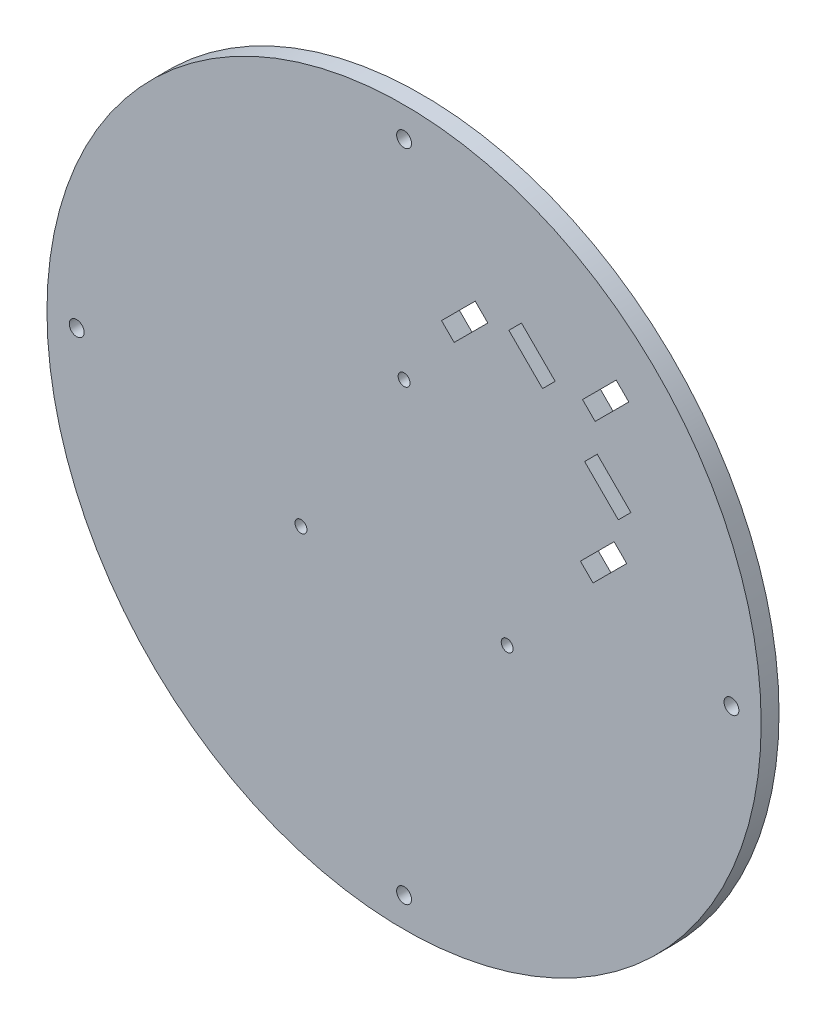
ISO-10303-21;
HEADER;
FILE_DESCRIPTION(('STEP AP214'),'2;1');
FILE_NAME('part.step','',(''),(''),'','','');
FILE_SCHEMA(('AUTOMOTIVE_DESIGN { 1 0 10303 214 1 1 1 1 }'));
ENDSEC;
DATA;
#1=APPLICATION_CONTEXT('core data for automotive mechanical design processes');
#2=APPLICATION_PROTOCOL_DEFINITION('international standard','automotive_design',2000,#1);
#3=PRODUCT_CONTEXT('',#1,'mechanical');
#4=PRODUCT('Part','Part','',(#3));
#5=PRODUCT_RELATED_PRODUCT_CATEGORY('part','',(#4));
#6=PRODUCT_DEFINITION_FORMATION('','',#4);
#7=PRODUCT_DEFINITION_CONTEXT('part definition',#1,'design');
#8=PRODUCT_DEFINITION('design','',#6,#7);
#9=PRODUCT_DEFINITION_SHAPE('','',#8);
#10=(LENGTH_UNIT() NAMED_UNIT(*) SI_UNIT(.MILLI.,.METRE.));
#11=(NAMED_UNIT(*) PLANE_ANGLE_UNIT() SI_UNIT($,.RADIAN.));
#12=(NAMED_UNIT(*) SI_UNIT($,.STERADIAN.) SOLID_ANGLE_UNIT());
#13=UNCERTAINTY_MEASURE_WITH_UNIT(LENGTH_MEASURE(1.E-05),#10,'distance_accuracy_value','');
#14=(GEOMETRIC_REPRESENTATION_CONTEXT(3) GLOBAL_UNCERTAINTY_ASSIGNED_CONTEXT((#13)) GLOBAL_UNIT_ASSIGNED_CONTEXT((#10,
#11,#12)) REPRESENTATION_CONTEXT('',''));
#15=CARTESIAN_POINT('',(0.,0.,0.));
#16=DIRECTION('',(0.,0.,1.));
#17=DIRECTION('',(1.,0.,0.));
#18=AXIS2_PLACEMENT_3D('',#15,#16,#17);
#19=CARTESIAN_POINT('',(24.6780266634107,24.6780266634104,3.));
#20=DIRECTION('',(-0.707106781186551,-0.707106781186544,0.));
#21=DIRECTION('',(0.707106781186544,-0.707106781186551,0.));
#22=AXIS2_PLACEMENT_3D('',#19,#20,#21);
#23=PLANE('',#22);
#24=DIRECTION('',(-0.707106781186544,0.707106781186551,0.));
#25=VECTOR('',#24,1.);
#26=CARTESIAN_POINT('',(24.6780266634107,24.6780266634104,0.));
#27=LINE('',#26,#25);
#28=CARTESIAN_POINT('',(37.4059487247684,11.9501046020526,0.));
#29=VERTEX_POINT('',#28);
#30=CARTESIAN_POINT('',(35.2846283812088,14.0714249456122,0.));
#31=VERTEX_POINT('',#30);
#32=EDGE_CURVE('E273',#29,#31,#27,.T.);
#33=ORIENTED_EDGE('',*,*,#32,.F.);
#34=DIRECTION('',(0.,0.,-1.));
#35=VECTOR('',#34,1.);
#36=CARTESIAN_POINT('',(37.4059487247684,11.9501046020526,3.));
#37=LINE('',#36,#35);
#38=CARTESIAN_POINT('',(37.4059487247684,11.9501046020526,3.));
#39=VERTEX_POINT('',#38);
#40=EDGE_CURVE('E11',#39,#29,#37,.T.);
#41=ORIENTED_EDGE('',*,*,#40,.F.);
#42=DIRECTION('',(-0.707106781186544,0.707106781186551,0.));
#43=VECTOR('',#42,1.);
#44=CARTESIAN_POINT('',(24.6780266634107,24.6780266634104,3.));
#45=LINE('',#44,#43);
#46=CARTESIAN_POINT('',(35.2846283812088,14.0714249456122,3.));
#47=VERTEX_POINT('',#46);
#48=EDGE_CURVE('E199',#39,#47,#45,.T.);
#49=ORIENTED_EDGE('',*,*,#48,.T.);
#50=DIRECTION('',(0.,0.,-1.));
#51=VECTOR('',#50,1.);
#52=CARTESIAN_POINT('',(35.2846283812088,14.0714249456122,3.));
#53=LINE('',#52,#51);
#54=EDGE_CURVE('E57',#47,#31,#53,.T.);
#55=ORIENTED_EDGE('',*,*,#54,.T.);
#56=EDGE_LOOP('',(#33,#41,#49,#55));
#57=FACE_BOUND('',#56,.T.);
#58=ADVANCED_FACE('F38',(#57),#23,.T.);
#59=CARTESIAN_POINT('',(12.7279220613579,-12.7279220613579,3.));
#60=DIRECTION('',(-0.707106781186547,0.707106781186548,0.));
#61=DIRECTION('',(-0.707106781186548,-0.707106781186547,0.));
#62=AXIS2_PLACEMENT_3D('',#59,#60,#61);
#63=PLANE('',#62);
#64=DIRECTION('',(0.707106781186548,0.707106781186547,0.));
#65=VECTOR('',#64,1.);
#66=CARTESIAN_POINT('',(12.7279220613579,-12.7279220613579,0.));
#67=LINE('',#66,#65);
#68=CARTESIAN_POINT('',(31.749094475276,6.2932503525602,0.));
#69=VERTEX_POINT('',#68);
#70=EDGE_CURVE('E187',#69,#29,#67,.T.);
#71=ORIENTED_EDGE('',*,*,#70,.F.);
#72=DIRECTION('',(0.,0.,-1.));
#73=VECTOR('',#72,1.);
#74=CARTESIAN_POINT('',(31.749094475276,6.2932503525602,3.));
#75=LINE('',#74,#73);
#76=CARTESIAN_POINT('',(31.749094475276,6.2932503525602,3.));
#77=VERTEX_POINT('',#76);
#78=EDGE_CURVE('E48',#77,#69,#75,.T.);
#79=ORIENTED_EDGE('',*,*,#78,.F.);
#80=DIRECTION('',(0.707106781186548,0.707106781186547,0.));
#81=VECTOR('',#80,1.);
#82=CARTESIAN_POINT('',(12.7279220613579,-12.7279220613579,3.));
#83=LINE('',#82,#81);
#84=EDGE_CURVE('E185',#77,#39,#83,.T.);
#85=ORIENTED_EDGE('',*,*,#84,.T.);
#86=ORIENTED_EDGE('',*,*,#40,.T.);
#87=EDGE_LOOP('',(#71,#79,#85,#86));
#88=FACE_BOUND('',#87,.T.);
#89=ADVANCED_FACE('F184',(#88),#63,.T.);
#90=CARTESIAN_POINT('',(19.0211724139182,19.0211724139181,3.));
#91=DIRECTION('',(0.70710678118655,0.707106781186545,0.));
#92=DIRECTION('',(-0.707106781186545,0.70710678118655,0.));
#93=AXIS2_PLACEMENT_3D('',#90,#91,#92);
#94=PLANE('',#93);
#95=DIRECTION('',(0.707106781186545,-0.70710678118655,0.));
#96=VECTOR('',#95,1.);
#97=CARTESIAN_POINT('',(19.0211724139182,19.0211724139181,0.));
#98=LINE('',#97,#96);
#99=CARTESIAN_POINT('',(29.6277741317164,8.41457069611985,0.));
#100=VERTEX_POINT('',#99);
#101=EDGE_CURVE('E276',#100,#69,#98,.T.);
#102=ORIENTED_EDGE('',*,*,#101,.F.);
#103=DIRECTION('',(0.,0.,-1.));
#104=VECTOR('',#103,1.);
#105=CARTESIAN_POINT('',(29.6277741317164,8.41457069611985,3.));
#106=LINE('',#105,#104);
#107=CARTESIAN_POINT('',(29.6277741317164,8.41457069611985,3.));
#108=VERTEX_POINT('',#107);
#109=EDGE_CURVE('E118',#108,#100,#106,.T.);
#110=ORIENTED_EDGE('',*,*,#109,.F.);
#111=DIRECTION('',(0.707106781186545,-0.70710678118655,0.));
#112=VECTOR('',#111,1.);
#113=CARTESIAN_POINT('',(19.0211724139182,19.0211724139181,3.));
#114=LINE('',#113,#112);
#115=EDGE_CURVE('E198',#108,#77,#114,.T.);
#116=ORIENTED_EDGE('',*,*,#115,.T.);
#117=ORIENTED_EDGE('',*,*,#78,.T.);
#118=EDGE_LOOP('',(#102,#110,#116,#117));
#119=FACE_BOUND('',#118,.T.);
#120=ADVANCED_FACE('F201',(#119),#94,.T.);
#121=CARTESIAN_POINT('',(19.0211724139184,19.0211724139183,3.));
#122=DIRECTION('',(-0.707106781186548,-0.707106781186546,0.));
#123=DIRECTION('',(0.707106781186547,-0.707106781186549,0.));
#124=AXIS2_PLACEMENT_3D('',#121,#122,#123);
#125=PLANE('',#124);
#126=DIRECTION('',(-0.707106781186547,0.707106781186549,0.));
#127=VECTOR('',#126,1.);
#128=CARTESIAN_POINT('',(19.0211724139184,19.0211724139183,0.));
#129=LINE('',#128,#127);
#130=CARTESIAN_POINT('',(8.41457069611997,29.6277741317168,0.));
#131=VERTEX_POINT('',#130);
#132=CARTESIAN_POINT('',(6.29325035256034,31.7490944752764,0.));
#133=VERTEX_POINT('',#132);
#134=EDGE_CURVE('E264',#131,#133,#129,.T.);
#135=ORIENTED_EDGE('',*,*,#134,.T.);
#136=DIRECTION('',(0.,0.,-1.));
#137=VECTOR('',#136,1.);
#138=CARTESIAN_POINT('',(6.29325035256034,31.7490944752764,3.));
#139=LINE('',#138,#137);
#140=CARTESIAN_POINT('',(6.29325035256034,31.7490944752764,3.));
#141=VERTEX_POINT('',#140);
#142=EDGE_CURVE('E289',#141,#133,#139,.T.);
#143=ORIENTED_EDGE('',*,*,#142,.F.);
#144=DIRECTION('',(-0.707106781186547,0.707106781186549,0.));
#145=VECTOR('',#144,1.);
#146=CARTESIAN_POINT('',(19.0211724139184,19.0211724139183,3.));
#147=LINE('',#146,#145);
#148=CARTESIAN_POINT('',(8.41457069611997,29.6277741317168,3.));
#149=VERTEX_POINT('',#148);
#150=EDGE_CURVE('E391',#149,#141,#147,.T.);
#151=ORIENTED_EDGE('',*,*,#150,.F.);
#152=DIRECTION('',(0.,0.,-1.));
#153=VECTOR('',#152,1.);
#154=CARTESIAN_POINT('',(8.41457069611997,29.6277741317168,3.));
#155=LINE('',#154,#153);
#156=EDGE_CURVE('E291',#149,#131,#155,.T.);
#157=ORIENTED_EDGE('',*,*,#156,.T.);
#158=EDGE_LOOP('',(#135,#143,#151,#157));
#159=FACE_BOUND('',#158,.T.);
#160=ADVANCED_FACE('F429',(#159),#125,.F.);
#161=CARTESIAN_POINT('',(-12.727922061358,12.727922061358,3.));
#162=DIRECTION('',(-0.707106781186547,0.707106781186547,0.));
#163=DIRECTION('',(-0.707106781186548,-0.707106781186548,0.));
#164=AXIS2_PLACEMENT_3D('',#161,#162,#163);
#165=PLANE('',#164);
#166=DIRECTION('',(0.707106781186548,0.707106781186548,0.));
#167=VECTOR('',#166,1.);
#168=CARTESIAN_POINT('',(-12.727922061358,12.727922061358,0.));
#169=LINE('',#168,#167);
#170=CARTESIAN_POINT('',(11.9501046020527,37.4059487247688,0.));
#171=VERTEX_POINT('',#170);
#172=EDGE_CURVE('E267',#133,#171,#169,.T.);
#173=ORIENTED_EDGE('',*,*,#172,.T.);
#174=DIRECTION('',(0.,0.,-1.));
#175=VECTOR('',#174,1.);
#176=CARTESIAN_POINT('',(11.9501046020527,37.4059487247688,3.));
#177=LINE('',#176,#175);
#178=CARTESIAN_POINT('',(11.9501046020527,37.4059487247688,3.));
#179=VERTEX_POINT('',#178);
#180=EDGE_CURVE('E298',#179,#171,#177,.T.);
#181=ORIENTED_EDGE('',*,*,#180,.F.);
#182=DIRECTION('',(0.707106781186548,0.707106781186548,0.));
#183=VECTOR('',#182,1.);
#184=CARTESIAN_POINT('',(-12.727922061358,12.727922061358,3.));
#185=LINE('',#184,#183);
#186=EDGE_CURVE('E394',#141,#179,#185,.T.);
#187=ORIENTED_EDGE('',*,*,#186,.F.);
#188=ORIENTED_EDGE('',*,*,#142,.T.);
#189=EDGE_LOOP('',(#173,#181,#187,#188));
#190=FACE_BOUND('',#189,.T.);
#191=ADVANCED_FACE('F425',(#190),#165,.F.);
#192=CARTESIAN_POINT('',(24.6780266634108,24.6780266634107,3.));
#193=DIRECTION('',(0.707106781186549,0.707106781186546,0.));
#194=DIRECTION('',(-0.707106781186546,0.707106781186549,0.));
#195=AXIS2_PLACEMENT_3D('',#192,#193,#194);
#196=PLANE('',#195);
#197=DIRECTION('',(0.707106781186546,-0.707106781186549,0.));
#198=VECTOR('',#197,1.);
#199=CARTESIAN_POINT('',(24.6780266634108,24.6780266634107,0.));
#200=LINE('',#199,#198);
#201=CARTESIAN_POINT('',(14.0714249456124,35.2846283812092,0.));
#202=VERTEX_POINT('',#201);
#203=EDGE_CURVE('E269',#171,#202,#200,.T.);
#204=ORIENTED_EDGE('',*,*,#203,.T.);
#205=DIRECTION('',(0.,0.,-1.));
#206=VECTOR('',#205,1.);
#207=CARTESIAN_POINT('',(14.0714249456124,35.2846283812092,3.));
#208=LINE('',#207,#206);
#209=CARTESIAN_POINT('',(14.0714249456124,35.2846283812092,3.));
#210=VERTEX_POINT('',#209);
#211=EDGE_CURVE('E294',#210,#202,#208,.T.);
#212=ORIENTED_EDGE('',*,*,#211,.F.);
#213=DIRECTION('',(0.707106781186546,-0.707106781186549,0.));
#214=VECTOR('',#213,1.);
#215=CARTESIAN_POINT('',(24.6780266634108,24.6780266634107,3.));
#216=LINE('',#215,#214);
#217=EDGE_CURVE('E396',#179,#210,#216,.T.);
#218=ORIENTED_EDGE('',*,*,#217,.F.);
#219=ORIENTED_EDGE('',*,*,#180,.T.);
#220=EDGE_LOOP('',(#204,#212,#218,#219));
#221=FACE_BOUND('',#220,.T.);
#222=ADVANCED_FACE('F421',(#221),#196,.F.);
#223=CARTESIAN_POINT('',(36.698841943582,36.698841943582,3.));
#224=DIRECTION('',(0.707106781186547,0.707106781186547,0.));
#225=DIRECTION('',(-0.707106781186548,0.707106781186548,0.));
#226=AXIS2_PLACEMENT_3D('',#223,#224,#225);
#227=PLANE('',#226);
#228=DIRECTION('',(0.707106781186548,-0.707106781186548,0.));
#229=VECTOR('',#228,1.);
#230=CARTESIAN_POINT('',(36.698841943582,36.698841943582,0.));
#231=LINE('',#230,#229);
#232=CARTESIAN_POINT('',(35.6381817718023,37.7595021153618,0.));
#233=VERTEX_POINT('',#232);
#234=CARTESIAN_POINT('',(37.7595021153619,35.6381817718021,0.));
#235=VERTEX_POINT('',#234);
#236=EDGE_CURVE('E253',#233,#235,#231,.T.);
#237=ORIENTED_EDGE('',*,*,#236,.T.);
#238=DIRECTION('',(0.,0.,-1.));
#239=VECTOR('',#238,1.);
#240=CARTESIAN_POINT('',(37.7595021153619,35.6381817718021,3.));
#241=LINE('',#240,#239);
#242=CARTESIAN_POINT('',(37.7595021153619,35.6381817718021,3.));
#243=VERTEX_POINT('',#242);
#244=EDGE_CURVE('E295',#243,#235,#241,.T.);
#245=ORIENTED_EDGE('',*,*,#244,.F.);
#246=DIRECTION('',(0.707106781186548,-0.707106781186548,0.));
#247=VECTOR('',#246,1.);
#248=CARTESIAN_POINT('',(36.698841943582,36.698841943582,3.));
#249=LINE('',#248,#247);
#250=CARTESIAN_POINT('',(35.6381817718023,37.7595021153618,3.));
#251=VERTEX_POINT('',#250);
#252=EDGE_CURVE('E381',#251,#243,#249,.T.);
#253=ORIENTED_EDGE('',*,*,#252,.F.);
#254=DIRECTION('',(0.,0.,-1.));
#255=VECTOR('',#254,1.);
#256=CARTESIAN_POINT('',(35.6381817718023,37.7595021153618,3.));
#257=LINE('',#256,#255);
#258=EDGE_CURVE('E303',#251,#233,#257,.T.);
#259=ORIENTED_EDGE('',*,*,#258,.T.);
#260=EDGE_LOOP('',(#237,#245,#253,#259));
#261=FACE_BOUND('',#260,.T.);
#262=ADVANCED_FACE('F424',(#261),#227,.F.);
#263=CARTESIAN_POINT('',(1.06066017177984,-1.06066017177985,3.));
#264=DIRECTION('',(0.707106781186546,-0.707106781186549,0.));
#265=DIRECTION('',(0.707106781186549,0.707106781186546,0.));
#266=AXIS2_PLACEMENT_3D('',#263,#264,#265);
#267=PLANE('',#266);
#268=DIRECTION('',(-0.707106781186549,-0.707106781186546,0.));
#269=VECTOR('',#268,1.);
#270=CARTESIAN_POINT('',(1.06066017177984,-1.06066017177985,0.));
#271=LINE('',#270,#269);
#272=CARTESIAN_POINT('',(32.1026478658696,29.9813275223098,0.));
#273=VERTEX_POINT('',#272);
#274=EDGE_CURVE('E256',#235,#273,#271,.T.);
#275=ORIENTED_EDGE('',*,*,#274,.T.);
#276=DIRECTION('',(0.,0.,-1.));
#277=VECTOR('',#276,1.);
#278=CARTESIAN_POINT('',(32.1026478658696,29.9813275223098,3.));
#279=LINE('',#278,#277);
#280=CARTESIAN_POINT('',(32.1026478658696,29.9813275223098,3.));
#281=VERTEX_POINT('',#280);
#282=EDGE_CURVE('E309',#281,#273,#279,.T.);
#283=ORIENTED_EDGE('',*,*,#282,.F.);
#284=DIRECTION('',(-0.707106781186549,-0.707106781186546,0.));
#285=VECTOR('',#284,1.);
#286=CARTESIAN_POINT('',(1.06066017177984,-1.06066017177985,3.));
#287=LINE('',#286,#285);
#288=EDGE_CURVE('E384',#243,#281,#287,.T.);
#289=ORIENTED_EDGE('',*,*,#288,.F.);
#290=ORIENTED_EDGE('',*,*,#244,.T.);
#291=EDGE_LOOP('',(#275,#283,#289,#290));
#292=FACE_BOUND('',#291,.T.);
#293=ADVANCED_FACE('F442',(#292),#267,.F.);
#294=CARTESIAN_POINT('',(31.0419876940898,31.0419876940896,3.));
#295=DIRECTION('',(0.70710678118655,0.707106781186545,0.));
#296=DIRECTION('',(-0.707106781186545,0.70710678118655,0.));
#297=AXIS2_PLACEMENT_3D('',#294,#295,#296);
#298=PLANE('',#297);
#299=DIRECTION('',(0.707106781186545,-0.70710678118655,0.));
#300=VECTOR('',#299,1.);
#301=CARTESIAN_POINT('',(31.0419876940898,31.0419876940896,0.));
#302=LINE('',#301,#300);
#303=CARTESIAN_POINT('',(29.9813275223099,32.1026478658694,0.));
#304=VERTEX_POINT('',#303);
#305=EDGE_CURVE('E259',#304,#273,#302,.T.);
#306=ORIENTED_EDGE('',*,*,#305,.F.);
#307=DIRECTION('',(0.,0.,-1.));
#308=VECTOR('',#307,1.);
#309=CARTESIAN_POINT('',(29.9813275223099,32.1026478658694,3.));
#310=LINE('',#309,#308);
#311=CARTESIAN_POINT('',(29.9813275223099,32.1026478658694,3.));
#312=VERTEX_POINT('',#311);
#313=EDGE_CURVE('E306',#312,#304,#310,.T.);
#314=ORIENTED_EDGE('',*,*,#313,.F.);
#315=DIRECTION('',(0.707106781186545,-0.70710678118655,0.));
#316=VECTOR('',#315,1.);
#317=CARTESIAN_POINT('',(31.0419876940898,31.0419876940896,3.));
#318=LINE('',#317,#316);
#319=EDGE_CURVE('E386',#312,#281,#318,.T.);
#320=ORIENTED_EDGE('',*,*,#319,.T.);
#321=ORIENTED_EDGE('',*,*,#282,.T.);
#322=EDGE_LOOP('',(#306,#314,#320,#321));
#323=FACE_BOUND('',#322,.T.);
#324=ADVANCED_FACE('F438',(#323),#298,.T.);
#325=CARTESIAN_POINT('',(28.9206673505308,28.9206673505285,3.));
#326=DIRECTION('',(-0.707106781186575,-0.70710678118652,0.));
#327=DIRECTION('',(0.70710678118652,-0.707106781186575,0.));
#328=AXIS2_PLACEMENT_3D('',#325,#326,#327);
#329=PLANE('',#328);
#330=DIRECTION('',(-0.70710678118652,0.707106781186576,0.));
#331=VECTOR('',#330,1.);
#332=CARTESIAN_POINT('',(28.9206673505308,28.9206673505285,0.));
#333=LINE('',#332,#331);
#334=CARTESIAN_POINT('',(25.3851334445971,32.4562012564625,0.));
#335=VERTEX_POINT('',#334);
#336=CARTESIAN_POINT('',(19.728279195105,38.113055505955,0.));
#337=VERTEX_POINT('',#336);
#338=EDGE_CURVE('E223',#335,#337,#333,.T.);
#339=ORIENTED_EDGE('',*,*,#338,.F.);
#340=DIRECTION('',(0.,0.,-1.));
#341=VECTOR('',#340,1.);
#342=CARTESIAN_POINT('',(25.3851334445971,32.4562012564625,3.));
#343=LINE('',#342,#341);
#344=CARTESIAN_POINT('',(25.3851334445971,32.4562012564625,3.));
#345=VERTEX_POINT('',#344);
#346=EDGE_CURVE('E307',#345,#335,#343,.T.);
#347=ORIENTED_EDGE('',*,*,#346,.F.);
#348=DIRECTION('',(-0.70710678118652,0.707106781186576,0.));
#349=VECTOR('',#348,1.);
#350=CARTESIAN_POINT('',(28.9206673505308,28.9206673505285,3.));
#351=LINE('',#350,#349);
#352=CARTESIAN_POINT('',(19.728279195105,38.113055505955,3.));
#353=VERTEX_POINT('',#352);
#354=EDGE_CURVE('E346',#345,#353,#351,.T.);
#355=ORIENTED_EDGE('',*,*,#354,.T.);
#356=DIRECTION('',(0.,0.,-1.));
#357=VECTOR('',#356,1.);
#358=CARTESIAN_POINT('',(19.728279195105,38.113055505955,3.));
#359=LINE('',#358,#357);
#360=EDGE_CURVE('E313',#353,#337,#359,.T.);
#361=ORIENTED_EDGE('',*,*,#360,.T.);
#362=EDGE_LOOP('',(#339,#347,#355,#361));
#363=FACE_BOUND('',#362,.T.);
#364=ADVANCED_FACE('F441',(#363),#329,.T.);
#365=CARTESIAN_POINT('',(-3.53553390593215,3.535533905932,3.));
#366=DIRECTION('',(-0.707106781186563,0.707106781186532,0.));
#367=DIRECTION('',(-0.707106781186532,-0.707106781186563,0.));
#368=AXIS2_PLACEMENT_3D('',#365,#366,#367);
#369=PLANE('',#368);
#370=DIRECTION('',(0.707106781186532,0.707106781186563,0.));
#371=VECTOR('',#370,1.);
#372=CARTESIAN_POINT('',(-3.53553390593215,3.535533905932,0.));
#373=LINE('',#372,#371);
#374=CARTESIAN_POINT('',(23.2638131010377,30.334880912903,0.));
#375=VERTEX_POINT('',#374);
#376=EDGE_CURVE('E226',#375,#335,#373,.T.);
#377=ORIENTED_EDGE('',*,*,#376,.F.);
#378=DIRECTION('',(0.,0.,-1.));
#379=VECTOR('',#378,1.);
#380=CARTESIAN_POINT('',(23.2638131010377,30.334880912903,3.));
#381=LINE('',#380,#379);
#382=CARTESIAN_POINT('',(23.2638131010377,30.334880912903,3.));
#383=VERTEX_POINT('',#382);
#384=EDGE_CURVE('E317',#383,#375,#381,.T.);
#385=ORIENTED_EDGE('',*,*,#384,.F.);
#386=DIRECTION('',(0.707106781186532,0.707106781186563,0.));
#387=VECTOR('',#386,1.);
#388=CARTESIAN_POINT('',(-3.53553390593215,3.535533905932,3.));
#389=LINE('',#388,#387);
#390=EDGE_CURVE('E350',#383,#345,#389,.T.);
#391=ORIENTED_EDGE('',*,*,#390,.T.);
#392=ORIENTED_EDGE('',*,*,#346,.T.);
#393=EDGE_LOOP('',(#377,#385,#391,#392));
#394=FACE_BOUND('',#393,.T.);
#395=ADVANCED_FACE('F480',(#394),#369,.T.);
#396=CARTESIAN_POINT('',(26.7993470069695,26.7993470069716,3.));
#397=DIRECTION('',(0.70710678118652,0.707106781186575,0.));
#398=DIRECTION('',(-0.707106781186575,0.70710678118652,0.));
#399=AXIS2_PLACEMENT_3D('',#396,#397,#398);
#400=PLANE('',#399);
#401=DIRECTION('',(0.707106781186576,-0.70710678118652,0.));
#402=VECTOR('',#401,1.);
#403=CARTESIAN_POINT('',(26.7993470069695,26.7993470069716,0.));
#404=LINE('',#403,#402);
#405=CARTESIAN_POINT('',(17.6069588515451,35.9917351623952,0.));
#406=VERTEX_POINT('',#405);
#407=EDGE_CURVE('E229',#406,#375,#404,.T.);
#408=ORIENTED_EDGE('',*,*,#407,.F.);
#409=DIRECTION('',(0.,0.,-1.));
#410=VECTOR('',#409,1.);
#411=CARTESIAN_POINT('',(17.6069588515451,35.9917351623952,3.));
#412=LINE('',#411,#410);
#413=CARTESIAN_POINT('',(17.6069588515451,35.9917351623952,3.));
#414=VERTEX_POINT('',#413);
#415=EDGE_CURVE('E315',#414,#406,#412,.T.);
#416=ORIENTED_EDGE('',*,*,#415,.F.);
#417=DIRECTION('',(0.707106781186576,-0.70710678118652,0.));
#418=VECTOR('',#417,1.);
#419=CARTESIAN_POINT('',(26.7993470069695,26.7993470069716,3.));
#420=LINE('',#419,#418);
#421=EDGE_CURVE('E357',#414,#383,#420,.T.);
#422=ORIENTED_EDGE('',*,*,#421,.T.);
#423=ORIENTED_EDGE('',*,*,#384,.T.);
#424=EDGE_LOOP('',(#408,#416,#422,#423));
#425=FACE_BOUND('',#424,.T.);
#426=ADVANCED_FACE('F477',(#425),#400,.T.);
#427=CARTESIAN_POINT('',(3.53553390593273,-3.53553390593274,3.));
#428=DIRECTION('',(-0.707106781186546,0.707106781186548,0.));
#429=DIRECTION('',(-0.707106781186549,-0.707106781186546,0.));
#430=AXIS2_PLACEMENT_3D('',#427,#428,#429);
#431=PLANE('',#430);
#432=DIRECTION('',(0.707106781186549,0.707106781186546,0.));
#433=VECTOR('',#432,1.);
#434=CARTESIAN_POINT('',(3.53553390593273,-3.53553390593274,0.));
#435=LINE('',#434,#433);
#436=CARTESIAN_POINT('',(30.3348809129029,23.2638131010373,0.));
#437=VERTEX_POINT('',#436);
#438=CARTESIAN_POINT('',(32.4562012564625,25.385133444597,0.));
#439=VERTEX_POINT('',#438);
#440=EDGE_CURVE('E214',#437,#439,#435,.T.);
#441=ORIENTED_EDGE('',*,*,#440,.T.);
#442=DIRECTION('',(0.,0.,-1.));
#443=VECTOR('',#442,1.);
#444=CARTESIAN_POINT('',(32.4562012564625,25.385133444597,3.));
#445=LINE('',#444,#443);
#446=CARTESIAN_POINT('',(32.4562012564625,25.385133444597,3.));
#447=VERTEX_POINT('',#446);
#448=EDGE_CURVE('E42',#447,#439,#445,.T.);
#449=ORIENTED_EDGE('',*,*,#448,.F.);
#450=DIRECTION('',(0.707106781186549,0.707106781186546,0.));
#451=VECTOR('',#450,1.);
#452=CARTESIAN_POINT('',(3.53553390593273,-3.53553390593274,3.));
#453=LINE('',#452,#451);
#454=CARTESIAN_POINT('',(30.3348809129029,23.2638131010373,3.));
#455=VERTEX_POINT('',#454);
#456=EDGE_CURVE('E287',#455,#447,#453,.T.);
#457=ORIENTED_EDGE('',*,*,#456,.F.);
#458=DIRECTION('',(0.,0.,-1.));
#459=VECTOR('',#458,1.);
#460=CARTESIAN_POINT('',(30.3348809129029,23.2638131010373,3.));
#461=LINE('',#460,#459);
#462=EDGE_CURVE('E213',#455,#437,#461,.T.);
#463=ORIENTED_EDGE('',*,*,#462,.T.);
#464=EDGE_LOOP('',(#441,#449,#457,#463));
#465=FACE_BOUND('',#464,.T.);
#466=ADVANCED_FACE('F40',(#465),#431,.F.);
#467=CARTESIAN_POINT('',(28.9206673505298,28.9206673505298,3.));
#468=DIRECTION('',(0.707106781186547,0.707106781186547,0.));
#469=DIRECTION('',(-0.707106781186548,0.707106781186548,0.));
#470=AXIS2_PLACEMENT_3D('',#467,#468,#469);
#471=PLANE('',#470);
#472=DIRECTION('',(0.707106781186548,-0.707106781186548,0.));
#473=VECTOR('',#472,1.);
#474=CARTESIAN_POINT('',(28.9206673505298,28.9206673505298,0.));
#475=LINE('',#474,#473);
#476=CARTESIAN_POINT('',(38.1130555059549,19.7282791951046,0.));
#477=VERTEX_POINT('',#476);
#478=EDGE_CURVE('E217',#439,#477,#475,.T.);
#479=ORIENTED_EDGE('',*,*,#478,.T.);
#480=DIRECTION('',(0.,0.,-1.));
#481=VECTOR('',#480,1.);
#482=CARTESIAN_POINT('',(38.1130555059549,19.7282791951046,3.));
#483=LINE('',#482,#481);
#484=CARTESIAN_POINT('',(38.1130555059549,19.7282791951046,3.));
#485=VERTEX_POINT('',#484);
#486=EDGE_CURVE('E324',#485,#477,#483,.T.);
#487=ORIENTED_EDGE('',*,*,#486,.F.);
#488=DIRECTION('',(0.707106781186548,-0.707106781186548,0.));
#489=VECTOR('',#488,1.);
#490=CARTESIAN_POINT('',(28.9206673505298,28.9206673505298,3.));
#491=LINE('',#490,#489);
#492=EDGE_CURVE('E131',#447,#485,#491,.T.);
#493=ORIENTED_EDGE('',*,*,#492,.F.);
#494=ORIENTED_EDGE('',*,*,#448,.T.);
#495=EDGE_LOOP('',(#479,#487,#493,#494));
#496=FACE_BOUND('',#495,.T.);
#497=ADVANCED_FACE('F330',(#496),#471,.F.);
#498=CARTESIAN_POINT('',(9.19238815542534,-9.19238815542526,3.));
#499=DIRECTION('',(0.707106781186551,-0.707106781186544,0.));
#500=DIRECTION('',(0.707106781186544,0.707106781186551,0.));
#501=AXIS2_PLACEMENT_3D('',#498,#499,#500);
#502=PLANE('',#501);
#503=DIRECTION('',(-0.707106781186544,-0.707106781186551,0.));
#504=VECTOR('',#503,1.);
#505=CARTESIAN_POINT('',(9.19238815542534,-9.19238815542526,0.));
#506=LINE('',#505,#504);
#507=CARTESIAN_POINT('',(35.9917351623953,17.606958851545,0.));
#508=VERTEX_POINT('',#507);
#509=EDGE_CURVE('E219',#477,#508,#506,.T.);
#510=ORIENTED_EDGE('',*,*,#509,.T.);
#511=DIRECTION('',(0.,0.,-1.));
#512=VECTOR('',#511,1.);
#513=CARTESIAN_POINT('',(35.9917351623953,17.606958851545,3.));
#514=LINE('',#513,#512);
#515=CARTESIAN_POINT('',(35.9917351623953,17.606958851545,3.));
#516=VERTEX_POINT('',#515);
#517=EDGE_CURVE('E322',#516,#508,#514,.T.);
#518=ORIENTED_EDGE('',*,*,#517,.F.);
#519=DIRECTION('',(-0.707106781186544,-0.707106781186551,0.));
#520=VECTOR('',#519,1.);
#521=CARTESIAN_POINT('',(9.19238815542534,-9.19238815542526,3.));
#522=LINE('',#521,#520);
#523=EDGE_CURVE('E347',#485,#516,#522,.T.);
#524=ORIENTED_EDGE('',*,*,#523,.F.);
#525=ORIENTED_EDGE('',*,*,#486,.T.);
#526=EDGE_LOOP('',(#510,#518,#524,#525));
#527=FACE_BOUND('',#526,.T.);
#528=ADVANCED_FACE('F340',(#527),#502,.F.);
#529=CARTESIAN_POINT('',(0.,0.,3.));
#530=DIRECTION('',(0.,0.,-1.));
#531=DIRECTION('',(-1.,0.,0.));
#532=AXIS2_PLACEMENT_3D('',#529,#530,#531);
#533=CYLINDRICAL_SURFACE('',#532,60.);
#534=CARTESIAN_POINT('',(0.,0.,3.));
#535=DIRECTION('',(0.,0.,1.));
#536=DIRECTION('',(1.,0.,0.));
#537=AXIS2_PLACEMENT_3D('',#534,#535,#536);
#538=CIRCLE('',#537,60.);
#539=CARTESIAN_POINT('',(60.,0.,3.));
#540=VERTEX_POINT('',#539);
#541=EDGE_CURVE('E204',#540,#540,#538,.T.);
#542=ORIENTED_EDGE('',*,*,#541,.F.);
#543=EDGE_LOOP('',(#542));
#544=FACE_BOUND('',#543,.T.);
#545=CARTESIAN_POINT('',(0.,0.,0.));
#546=DIRECTION('',(0.,0.,1.));
#547=DIRECTION('',(1.,0.,0.));
#548=AXIS2_PLACEMENT_3D('',#545,#546,#547);
#549=CIRCLE('',#548,60.);
#550=CARTESIAN_POINT('',(60.,0.,0.));
#551=VERTEX_POINT('',#550);
#552=EDGE_CURVE('E281',#551,#551,#549,.T.);
#553=ORIENTED_EDGE('',*,*,#552,.T.);
#554=EDGE_LOOP('',(#553));
#555=FACE_BOUND('',#554,.T.);
#556=ADVANCED_FACE('F402',(#544,#555),#533,.T.);
#557=CARTESIAN_POINT('',(10.6066017177982,-10.6066017177982,3.));
#558=DIRECTION('',(0.707106781186545,-0.70710678118655,0.));
#559=DIRECTION('',(0.70710678118655,0.707106781186545,0.));
#560=AXIS2_PLACEMENT_3D('',#557,#558,#559);
#561=PLANE('',#560);
#562=DIRECTION('',(-0.70710678118655,-0.707106781186545,0.));
#563=VECTOR('',#562,1.);
#564=CARTESIAN_POINT('',(10.6066017177982,-10.6066017177982,0.));
#565=LINE('',#564,#563);
#566=EDGE_CURVE('E278',#31,#100,#565,.T.);
#567=ORIENTED_EDGE('',*,*,#566,.F.);
#568=ORIENTED_EDGE('',*,*,#54,.F.);
#569=DIRECTION('',(-0.70710678118655,-0.707106781186545,0.));
#570=VECTOR('',#569,1.);
#571=CARTESIAN_POINT('',(10.6066017177982,-10.6066017177982,3.));
#572=LINE('',#571,#570);
#573=EDGE_CURVE('E202',#47,#108,#572,.T.);
#574=ORIENTED_EDGE('',*,*,#573,.T.);
#575=ORIENTED_EDGE('',*,*,#109,.T.);
#576=EDGE_LOOP('',(#567,#568,#574,#575));
#577=FACE_BOUND('',#576,.T.);
#578=ADVANCED_FACE('F399',(#577),#561,.T.);
#579=CARTESIAN_POINT('',(-10.6066017177984,10.6066017177984,3.));
#580=DIRECTION('',(0.707106781186546,-0.707106781186548,0.));
#581=DIRECTION('',(0.707106781186549,0.707106781186546,0.));
#582=AXIS2_PLACEMENT_3D('',#579,#580,#581);
#583=PLANE('',#582);
#584=DIRECTION('',(-0.707106781186549,-0.707106781186546,0.));
#585=VECTOR('',#584,1.);
#586=CARTESIAN_POINT('',(-10.6066017177984,10.6066017177984,0.));
#587=LINE('',#586,#585);
#588=EDGE_CURVE('E271',#202,#131,#587,.T.);
#589=ORIENTED_EDGE('',*,*,#588,.T.);
#590=ORIENTED_EDGE('',*,*,#156,.F.);
#591=DIRECTION('',(-0.707106781186549,-0.707106781186546,0.));
#592=VECTOR('',#591,1.);
#593=CARTESIAN_POINT('',(-10.6066017177984,10.6066017177984,3.));
#594=LINE('',#593,#592);
#595=EDGE_CURVE('E398',#210,#149,#594,.T.);
#596=ORIENTED_EDGE('',*,*,#595,.F.);
#597=ORIENTED_EDGE('',*,*,#211,.T.);
#598=EDGE_LOOP('',(#589,#590,#596,#597));
#599=FACE_BOUND('',#598,.T.);
#600=ADVANCED_FACE('F401',(#599),#583,.F.);
#601=CARTESIAN_POINT('',(-1.06066017177997,1.06066017177998,3.));
#602=DIRECTION('',(-0.707106781186543,0.707106781186552,0.));
#603=DIRECTION('',(-0.707106781186552,-0.707106781186543,0.));
#604=AXIS2_PLACEMENT_3D('',#601,#602,#603);
#605=PLANE('',#604);
#606=DIRECTION('',(0.707106781186552,0.707106781186543,0.));
#607=VECTOR('',#606,1.);
#608=CARTESIAN_POINT('',(-1.06066017177997,1.06066017177998,0.));
#609=LINE('',#608,#607);
#610=EDGE_CURVE('E262',#304,#233,#609,.T.);
#611=ORIENTED_EDGE('',*,*,#610,.T.);
#612=ORIENTED_EDGE('',*,*,#258,.F.);
#613=DIRECTION('',(0.707106781186552,0.707106781186543,0.));
#614=VECTOR('',#613,1.);
#615=CARTESIAN_POINT('',(-1.06066017177997,1.06066017177998,3.));
#616=LINE('',#615,#614);
#617=EDGE_CURVE('E389',#312,#251,#616,.T.);
#618=ORIENTED_EDGE('',*,*,#617,.F.);
#619=ORIENTED_EDGE('',*,*,#313,.T.);
#620=EDGE_LOOP('',(#611,#612,#618,#619));
#621=FACE_BOUND('',#620,.T.);
#622=ADVANCED_FACE('F408',(#621),#605,.F.);
#623=CARTESIAN_POINT('',(55.,0.,3.));
#624=DIRECTION('',(0.,0.,-1.));
#625=DIRECTION('',(-1.,0.,0.));
#626=AXIS2_PLACEMENT_3D('',#623,#624,#625);
#627=CYLINDRICAL_SURFACE('',#626,1.25);
#628=CARTESIAN_POINT('',(55.,0.,3.));
#629=DIRECTION('',(0.,0.,1.));
#630=DIRECTION('',(1.,0.,0.));
#631=AXIS2_PLACEMENT_3D('',#628,#629,#630);
#632=CIRCLE('',#631,1.25);
#633=CARTESIAN_POINT('',(56.25,0.,3.));
#634=VERTEX_POINT('',#633);
#635=EDGE_CURVE('E378',#634,#634,#632,.T.);
#636=ORIENTED_EDGE('',*,*,#635,.T.);
#637=EDGE_LOOP('',(#636));
#638=FACE_BOUND('',#637,.T.);
#639=CARTESIAN_POINT('',(55.,0.,0.));
#640=DIRECTION('',(0.,0.,1.));
#641=DIRECTION('',(1.,0.,0.));
#642=AXIS2_PLACEMENT_3D('',#639,#640,#641);
#643=CIRCLE('',#642,1.25);
#644=CARTESIAN_POINT('',(56.25,0.,0.));
#645=VERTEX_POINT('',#644);
#646=EDGE_CURVE('E250',#645,#645,#643,.T.);
#647=ORIENTED_EDGE('',*,*,#646,.F.);
#648=EDGE_LOOP('',(#647));
#649=FACE_BOUND('',#648,.T.);
#650=ADVANCED_FACE('F436',(#638,#649),#627,.F.);
#651=CARTESIAN_POINT('',(1.59594559789866E-13,55.,3.));
#652=DIRECTION('',(0.,0.,-1.));
#653=DIRECTION('',(-1.,0.,0.));
#654=AXIS2_PLACEMENT_3D('',#651,#652,#653);
#655=CYLINDRICAL_SURFACE('',#654,1.25000000000001);
#656=CARTESIAN_POINT('',(1.59594559789866E-13,55.,3.));
#657=DIRECTION('',(0.,0.,1.));
#658=DIRECTION('',(1.,0.,0.));
#659=AXIS2_PLACEMENT_3D('',#656,#657,#658);
#660=CIRCLE('',#659,1.25000000000001);
#661=CARTESIAN_POINT('',(1.25000000000017,55.,3.));
#662=VERTEX_POINT('',#661);
#663=EDGE_CURVE('E375',#662,#662,#660,.F.);
#664=ORIENTED_EDGE('',*,*,#663,.F.);
#665=EDGE_LOOP('',(#664));
#666=FACE_BOUND('',#665,.T.);
#667=CARTESIAN_POINT('',(1.59594559789866E-13,55.,0.));
#668=DIRECTION('',(0.,0.,1.));
#669=DIRECTION('',(1.,0.,0.));
#670=AXIS2_PLACEMENT_3D('',#667,#668,#669);
#671=CIRCLE('',#670,1.25000000000001);
#672=CARTESIAN_POINT('',(1.25000000000017,55.,0.));
#673=VERTEX_POINT('',#672);
#674=EDGE_CURVE('E247',#673,#673,#671,.F.);
#675=ORIENTED_EDGE('',*,*,#674,.T.);
#676=EDGE_LOOP('',(#675));
#677=FACE_BOUND('',#676,.T.);
#678=ADVANCED_FACE('F452',(#666,#677),#655,.F.);
#679=CARTESIAN_POINT('',(-55.,0.,3.));
#680=DIRECTION('',(0.,0.,-1.));
#681=DIRECTION('',(-1.,0.,0.));
#682=AXIS2_PLACEMENT_3D('',#679,#680,#681);
#683=CYLINDRICAL_SURFACE('',#682,1.25000000000002);
#684=CARTESIAN_POINT('',(-55.,0.,3.));
#685=DIRECTION('',(0.,0.,1.));
#686=DIRECTION('',(1.,0.,0.));
#687=AXIS2_PLACEMENT_3D('',#684,#685,#686);
#688=CIRCLE('',#687,1.25000000000002);
#689=CARTESIAN_POINT('',(-53.75,0.,3.));
#690=VERTEX_POINT('',#689);
#691=EDGE_CURVE('E372',#690,#690,#688,.T.);
#692=ORIENTED_EDGE('',*,*,#691,.T.);
#693=EDGE_LOOP('',(#692));
#694=FACE_BOUND('',#693,.T.);
#695=CARTESIAN_POINT('',(-55.,0.,0.));
#696=DIRECTION('',(0.,0.,1.));
#697=DIRECTION('',(1.,0.,0.));
#698=AXIS2_PLACEMENT_3D('',#695,#696,#697);
#699=CIRCLE('',#698,1.25000000000002);
#700=CARTESIAN_POINT('',(-53.75,0.,0.));
#701=VERTEX_POINT('',#700);
#702=EDGE_CURVE('E244',#701,#701,#699,.T.);
#703=ORIENTED_EDGE('',*,*,#702,.F.);
#704=EDGE_LOOP('',(#703));
#705=FACE_BOUND('',#704,.T.);
#706=ADVANCED_FACE('F456',(#694,#705),#683,.F.);
#707=CARTESIAN_POINT('',(0.,20.,3.));
#708=DIRECTION('',(0.,0.,-1.));
#709=DIRECTION('',(-1.,0.,0.));
#710=AXIS2_PLACEMENT_3D('',#707,#708,#709);
#711=CYLINDRICAL_SURFACE('',#710,1.);
#712=CARTESIAN_POINT('',(0.,20.,3.));
#713=DIRECTION('',(0.,0.,1.));
#714=DIRECTION('',(1.,0.,0.));
#715=AXIS2_PLACEMENT_3D('',#712,#713,#714);
#716=CIRCLE('',#715,1.);
#717=CARTESIAN_POINT('',(1.,20.,3.));
#718=VERTEX_POINT('',#717);
#719=EDGE_CURVE('E369',#718,#718,#716,.T.);
#720=ORIENTED_EDGE('',*,*,#719,.T.);
#721=EDGE_LOOP('',(#720));
#722=FACE_BOUND('',#721,.T.);
#723=CARTESIAN_POINT('',(0.,20.,0.));
#724=DIRECTION('',(0.,0.,1.));
#725=DIRECTION('',(1.,0.,0.));
#726=AXIS2_PLACEMENT_3D('',#723,#724,#725);
#727=CIRCLE('',#726,1.);
#728=CARTESIAN_POINT('',(1.,20.,0.));
#729=VERTEX_POINT('',#728);
#730=EDGE_CURVE('E241',#729,#729,#727,.T.);
#731=ORIENTED_EDGE('',*,*,#730,.F.);
#732=EDGE_LOOP('',(#731));
#733=FACE_BOUND('',#732,.T.);
#734=ADVANCED_FACE('F460',(#722,#733),#711,.F.);
#735=CARTESIAN_POINT('',(17.3205080756887,-10.0000000000001,3.));
#736=DIRECTION('',(0.,0.,-1.));
#737=DIRECTION('',(-1.,0.,0.));
#738=AXIS2_PLACEMENT_3D('',#735,#736,#737);
#739=CYLINDRICAL_SURFACE('',#738,1.);
#740=CARTESIAN_POINT('',(17.3205080756887,-10.0000000000001,3.));
#741=DIRECTION('',(0.,0.,1.));
#742=DIRECTION('',(1.,0.,0.));
#743=AXIS2_PLACEMENT_3D('',#740,#741,#742);
#744=CIRCLE('',#743,1.);
#745=CARTESIAN_POINT('',(18.3205080756887,-10.0000000000001,3.));
#746=VERTEX_POINT('',#745);
#747=EDGE_CURVE('E366',#746,#746,#744,.T.);
#748=ORIENTED_EDGE('',*,*,#747,.T.);
#749=EDGE_LOOP('',(#748));
#750=FACE_BOUND('',#749,.T.);
#751=CARTESIAN_POINT('',(17.3205080756887,-10.0000000000001,0.));
#752=DIRECTION('',(0.,0.,1.));
#753=DIRECTION('',(1.,0.,0.));
#754=AXIS2_PLACEMENT_3D('',#751,#752,#753);
#755=CIRCLE('',#754,1.);
#756=CARTESIAN_POINT('',(18.3205080756887,-10.0000000000001,0.));
#757=VERTEX_POINT('',#756);
#758=EDGE_CURVE('E238',#757,#757,#755,.T.);
#759=ORIENTED_EDGE('',*,*,#758,.F.);
#760=EDGE_LOOP('',(#759));
#761=FACE_BOUND('',#760,.T.);
#762=ADVANCED_FACE('F464',(#750,#761),#739,.F.);
#763=CARTESIAN_POINT('',(-17.3205080756887,-10.0000000000001,3.));
#764=DIRECTION('',(0.,0.,-1.));
#765=DIRECTION('',(-1.,0.,0.));
#766=AXIS2_PLACEMENT_3D('',#763,#764,#765);
#767=CYLINDRICAL_SURFACE('',#766,1.);
#768=CARTESIAN_POINT('',(-17.3205080756887,-10.0000000000001,3.));
#769=DIRECTION('',(0.,0.,1.));
#770=DIRECTION('',(1.,0.,0.));
#771=AXIS2_PLACEMENT_3D('',#768,#769,#770);
#772=CIRCLE('',#771,1.);
#773=CARTESIAN_POINT('',(-16.3205080756887,-10.0000000000001,3.));
#774=VERTEX_POINT('',#773);
#775=EDGE_CURVE('E363',#774,#774,#772,.T.);
#776=ORIENTED_EDGE('',*,*,#775,.T.);
#777=EDGE_LOOP('',(#776));
#778=FACE_BOUND('',#777,.T.);
#779=CARTESIAN_POINT('',(-17.3205080756887,-10.0000000000001,0.));
#780=DIRECTION('',(0.,0.,1.));
#781=DIRECTION('',(1.,0.,0.));
#782=AXIS2_PLACEMENT_3D('',#779,#780,#781);
#783=CIRCLE('',#782,1.);
#784=CARTESIAN_POINT('',(-16.3205080756887,-10.0000000000001,0.));
#785=VERTEX_POINT('',#784);
#786=EDGE_CURVE('E235',#785,#785,#783,.T.);
#787=ORIENTED_EDGE('',*,*,#786,.F.);
#788=EDGE_LOOP('',(#787));
#789=FACE_BOUND('',#788,.T.);
#790=ADVANCED_FACE('F468',(#778,#789),#767,.F.);
#791=CARTESIAN_POINT('',(-9.19238815542557,9.19238815542608,3.));
#792=DIRECTION('',(0.707106781186528,-0.707106781186567,0.));
#793=DIRECTION('',(0.707106781186567,0.707106781186528,0.));
#794=AXIS2_PLACEMENT_3D('',#791,#792,#793);
#795=PLANE('',#794);
#796=DIRECTION('',(-0.707106781186567,-0.707106781186528,0.));
#797=VECTOR('',#796,1.);
#798=CARTESIAN_POINT('',(-9.19238815542557,9.19238815542608,0.));
#799=LINE('',#798,#797);
#800=EDGE_CURVE('E232',#337,#406,#799,.T.);
#801=ORIENTED_EDGE('',*,*,#800,.F.);
#802=ORIENTED_EDGE('',*,*,#360,.F.);
#803=DIRECTION('',(-0.707106781186567,-0.707106781186528,0.));
#804=VECTOR('',#803,1.);
#805=CARTESIAN_POINT('',(-9.19238815542557,9.19238815542608,3.));
#806=LINE('',#805,#804);
#807=EDGE_CURVE('E360',#353,#414,#806,.T.);
#808=ORIENTED_EDGE('',*,*,#807,.T.);
#809=ORIENTED_EDGE('',*,*,#415,.T.);
#810=EDGE_LOOP('',(#801,#802,#808,#809));
#811=FACE_BOUND('',#810,.T.);
#812=ADVANCED_FACE('F472',(#811),#795,.T.);
#813=CARTESIAN_POINT('',(26.7993470069701,26.7993470069701,3.));
#814=DIRECTION('',(-0.707106781186548,-0.707106781186547,0.));
#815=DIRECTION('',(0.707106781186547,-0.707106781186548,0.));
#816=AXIS2_PLACEMENT_3D('',#813,#814,#815);
#817=PLANE('',#816);
#818=DIRECTION('',(-0.707106781186547,0.707106781186548,0.));
#819=VECTOR('',#818,1.);
#820=CARTESIAN_POINT('',(26.7993470069701,26.7993470069701,0.));
#821=LINE('',#820,#819);
#822=EDGE_CURVE('E221',#508,#437,#821,.T.);
#823=ORIENTED_EDGE('',*,*,#822,.T.);
#824=ORIENTED_EDGE('',*,*,#462,.F.);
#825=DIRECTION('',(-0.707106781186547,0.707106781186548,0.));
#826=VECTOR('',#825,1.);
#827=CARTESIAN_POINT('',(26.7993470069701,26.7993470069701,3.));
#828=LINE('',#827,#826);
#829=EDGE_CURVE('E344',#516,#455,#828,.T.);
#830=ORIENTED_EDGE('',*,*,#829,.F.);
#831=ORIENTED_EDGE('',*,*,#517,.T.);
#832=EDGE_LOOP('',(#823,#824,#830,#831));
#833=FACE_BOUND('',#832,.T.);
#834=ADVANCED_FACE('F343',(#833),#817,.F.);
#835=CARTESIAN_POINT('',(-1.80411241501588E-13,-55.,3.));
#836=DIRECTION('',(0.,0.,-1.));
#837=DIRECTION('',(-1.,0.,0.));
#838=AXIS2_PLACEMENT_3D('',#835,#836,#837);
#839=CYLINDRICAL_SURFACE('',#838,1.25);
#840=CARTESIAN_POINT('',(-1.80411241501588E-13,-55.,3.));
#841=DIRECTION('',(0.,0.,1.));
#842=DIRECTION('',(1.,0.,0.));
#843=AXIS2_PLACEMENT_3D('',#840,#841,#842);
#844=CIRCLE('',#843,1.25);
#845=CARTESIAN_POINT('',(1.24999999999982,-55.,3.));
#846=VERTEX_POINT('',#845);
#847=EDGE_CURVE('E210',#846,#846,#844,.F.);
#848=ORIENTED_EDGE('',*,*,#847,.F.);
#849=EDGE_LOOP('',(#848));
#850=FACE_BOUND('',#849,.T.);
#851=CARTESIAN_POINT('',(-1.80411241501588E-13,-55.,0.));
#852=DIRECTION('',(0.,0.,1.));
#853=DIRECTION('',(1.,0.,0.));
#854=AXIS2_PLACEMENT_3D('',#851,#852,#853);
#855=CIRCLE('',#854,1.25);
#856=CARTESIAN_POINT('',(1.24999999999982,-55.,0.));
#857=VERTEX_POINT('',#856);
#858=EDGE_CURVE('E284',#857,#857,#855,.F.);
#859=ORIENTED_EDGE('',*,*,#858,.T.);
#860=EDGE_LOOP('',(#859));
#861=FACE_BOUND('',#860,.T.);
#862=ADVANCED_FACE('F490',(#850,#861),#839,.F.);
#863=CARTESIAN_POINT('',(0.,0.,3.));
#864=DIRECTION('',(0.,0.,1.));
#865=DIRECTION('',(1.,0.,0.));
#866=AXIS2_PLACEMENT_3D('',#863,#864,#865);
#867=PLANE('',#866);
#868=ORIENTED_EDGE('',*,*,#456,.T.);
#869=ORIENTED_EDGE('',*,*,#492,.T.);
#870=ORIENTED_EDGE('',*,*,#523,.T.);
#871=ORIENTED_EDGE('',*,*,#829,.T.);
#872=EDGE_LOOP('',(#868,#869,#870,#871));
#873=FACE_BOUND('',#872,.T.);
#874=ORIENTED_EDGE('',*,*,#354,.F.);
#875=ORIENTED_EDGE('',*,*,#390,.F.);
#876=ORIENTED_EDGE('',*,*,#421,.F.);
#877=ORIENTED_EDGE('',*,*,#807,.F.);
#878=EDGE_LOOP('',(#874,#875,#876,#877));
#879=FACE_BOUND('',#878,.T.);
#880=ORIENTED_EDGE('',*,*,#775,.F.);
#881=EDGE_LOOP('',(#880));
#882=FACE_BOUND('',#881,.T.);
#883=ORIENTED_EDGE('',*,*,#747,.F.);
#884=EDGE_LOOP('',(#883));
#885=FACE_BOUND('',#884,.T.);
#886=ORIENTED_EDGE('',*,*,#719,.F.);
#887=EDGE_LOOP('',(#886));
#888=FACE_BOUND('',#887,.T.);
#889=ORIENTED_EDGE('',*,*,#691,.F.);
#890=EDGE_LOOP('',(#889));
#891=FACE_BOUND('',#890,.T.);
#892=ORIENTED_EDGE('',*,*,#663,.T.);
#893=EDGE_LOOP('',(#892));
#894=FACE_BOUND('',#893,.T.);
#895=ORIENTED_EDGE('',*,*,#635,.F.);
#896=EDGE_LOOP('',(#895));
#897=FACE_BOUND('',#896,.T.);
#898=ORIENTED_EDGE('',*,*,#252,.T.);
#899=ORIENTED_EDGE('',*,*,#288,.T.);
#900=ORIENTED_EDGE('',*,*,#319,.F.);
#901=ORIENTED_EDGE('',*,*,#617,.T.);
#902=EDGE_LOOP('',(#898,#899,#900,#901));
#903=FACE_BOUND('',#902,.T.);
#904=ORIENTED_EDGE('',*,*,#150,.T.);
#905=ORIENTED_EDGE('',*,*,#186,.T.);
#906=ORIENTED_EDGE('',*,*,#217,.T.);
#907=ORIENTED_EDGE('',*,*,#595,.T.);
#908=EDGE_LOOP('',(#904,#905,#906,#907));
#909=FACE_BOUND('',#908,.T.);
#910=ORIENTED_EDGE('',*,*,#48,.F.);
#911=ORIENTED_EDGE('',*,*,#84,.F.);
#912=ORIENTED_EDGE('',*,*,#115,.F.);
#913=ORIENTED_EDGE('',*,*,#573,.F.);
#914=EDGE_LOOP('',(#910,#911,#912,#913));
#915=FACE_BOUND('',#914,.T.);
#916=ORIENTED_EDGE('',*,*,#541,.T.);
#917=EDGE_LOOP('',(#916));
#918=FACE_BOUND('',#917,.T.);
#919=ORIENTED_EDGE('',*,*,#847,.T.);
#920=EDGE_LOOP('',(#919));
#921=FACE_BOUND('',#920,.T.);
#922=ADVANCED_FACE('F195',(#873,#879,#882,#885,#888,#891,#894,#897,#903,#909,#915,#918,#921),
#867,.T.);
#923=CARTESIAN_POINT('',(0.,0.,0.));
#924=DIRECTION('',(0.,0.,1.));
#925=DIRECTION('',(1.,0.,0.));
#926=AXIS2_PLACEMENT_3D('',#923,#924,#925);
#927=PLANE('',#926);
#928=ORIENTED_EDGE('',*,*,#440,.F.);
#929=ORIENTED_EDGE('',*,*,#822,.F.);
#930=ORIENTED_EDGE('',*,*,#509,.F.);
#931=ORIENTED_EDGE('',*,*,#478,.F.);
#932=EDGE_LOOP('',(#928,#929,#930,#931));
#933=FACE_BOUND('',#932,.T.);
#934=ORIENTED_EDGE('',*,*,#338,.T.);
#935=ORIENTED_EDGE('',*,*,#800,.T.);
#936=ORIENTED_EDGE('',*,*,#407,.T.);
#937=ORIENTED_EDGE('',*,*,#376,.T.);
#938=EDGE_LOOP('',(#934,#935,#936,#937));
#939=FACE_BOUND('',#938,.T.);
#940=ORIENTED_EDGE('',*,*,#786,.T.);
#941=EDGE_LOOP('',(#940));
#942=FACE_BOUND('',#941,.T.);
#943=ORIENTED_EDGE('',*,*,#758,.T.);
#944=EDGE_LOOP('',(#943));
#945=FACE_BOUND('',#944,.T.);
#946=ORIENTED_EDGE('',*,*,#730,.T.);
#947=EDGE_LOOP('',(#946));
#948=FACE_BOUND('',#947,.T.);
#949=ORIENTED_EDGE('',*,*,#702,.T.);
#950=EDGE_LOOP('',(#949));
#951=FACE_BOUND('',#950,.T.);
#952=ORIENTED_EDGE('',*,*,#674,.F.);
#953=EDGE_LOOP('',(#952));
#954=FACE_BOUND('',#953,.T.);
#955=ORIENTED_EDGE('',*,*,#646,.T.);
#956=EDGE_LOOP('',(#955));
#957=FACE_BOUND('',#956,.T.);
#958=ORIENTED_EDGE('',*,*,#236,.F.);
#959=ORIENTED_EDGE('',*,*,#610,.F.);
#960=ORIENTED_EDGE('',*,*,#305,.T.);
#961=ORIENTED_EDGE('',*,*,#274,.F.);
#962=EDGE_LOOP('',(#958,#959,#960,#961));
#963=FACE_BOUND('',#962,.T.);
#964=ORIENTED_EDGE('',*,*,#134,.F.);
#965=ORIENTED_EDGE('',*,*,#588,.F.);
#966=ORIENTED_EDGE('',*,*,#203,.F.);
#967=ORIENTED_EDGE('',*,*,#172,.F.);
#968=EDGE_LOOP('',(#964,#965,#966,#967));
#969=FACE_BOUND('',#968,.T.);
#970=ORIENTED_EDGE('',*,*,#32,.T.);
#971=ORIENTED_EDGE('',*,*,#566,.T.);
#972=ORIENTED_EDGE('',*,*,#101,.T.);
#973=ORIENTED_EDGE('',*,*,#70,.T.);
#974=EDGE_LOOP('',(#970,#971,#972,#973));
#975=FACE_BOUND('',#974,.T.);
#976=ORIENTED_EDGE('',*,*,#552,.F.);
#977=EDGE_LOOP('',(#976));
#978=FACE_BOUND('',#977,.T.);
#979=ORIENTED_EDGE('',*,*,#858,.F.);
#980=EDGE_LOOP('',(#979));
#981=FACE_BOUND('',#980,.T.);
#982=ADVANCED_FACE('F337',(#933,#939,#942,#945,#948,#951,#954,#957,#963,#969,#975,#978,#981),
#927,.F.);
#983=CLOSED_SHELL('',(#58,#89,#120,#160,#191,#222,#262,#293,#324,#364,#395,#426,#466,#497,#528,
#556,#578,#600,#622,#650,#678,#706,#734,#762,#790,#812,#834,#862,#922,#982));
#984=MANIFOLD_SOLID_BREP('B2',#983);
#985=ADVANCED_BREP_SHAPE_REPRESENTATION('',(#18,#984),#14);
#986=SHAPE_DEFINITION_REPRESENTATION(#9,#985);
ENDSEC;
END-ISO-10303-21;
